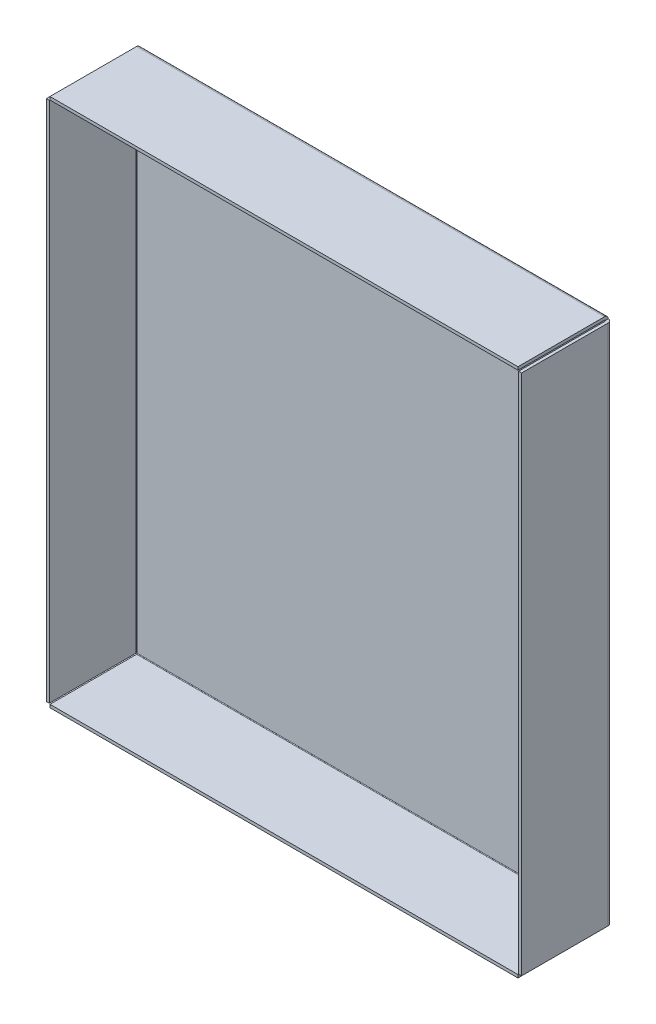
ISO-10303-21;
HEADER;
FILE_DESCRIPTION(('STEP AP214'),'2;1');
FILE_NAME('part.step','',(''),(''),'','','');
FILE_SCHEMA(('AUTOMOTIVE_DESIGN { 1 0 10303 214 1 1 1 1 }'));
ENDSEC;
DATA;
#1=APPLICATION_CONTEXT('core data for automotive mechanical design processes');
#2=APPLICATION_PROTOCOL_DEFINITION('international standard','automotive_design',2000,#1);
#3=PRODUCT_CONTEXT('',#1,'mechanical');
#4=PRODUCT('Part','Part','',(#3));
#5=PRODUCT_RELATED_PRODUCT_CATEGORY('part','',(#4));
#6=PRODUCT_DEFINITION_FORMATION('','',#4);
#7=PRODUCT_DEFINITION_CONTEXT('part definition',#1,'design');
#8=PRODUCT_DEFINITION('design','',#6,#7);
#9=PRODUCT_DEFINITION_SHAPE('','',#8);
#10=(LENGTH_UNIT() NAMED_UNIT(*) SI_UNIT(.MILLI.,.METRE.));
#11=(NAMED_UNIT(*) PLANE_ANGLE_UNIT() SI_UNIT($,.RADIAN.));
#12=(NAMED_UNIT(*) SI_UNIT($,.STERADIAN.) SOLID_ANGLE_UNIT());
#13=UNCERTAINTY_MEASURE_WITH_UNIT(LENGTH_MEASURE(1.E-05),#10,'distance_accuracy_value','');
#14=(GEOMETRIC_REPRESENTATION_CONTEXT(3) GLOBAL_UNCERTAINTY_ASSIGNED_CONTEXT((#13)) GLOBAL_UNIT_ASSIGNED_CONTEXT((#10,
#11,#12)) REPRESENTATION_CONTEXT('',''));
#15=CARTESIAN_POINT('',(0.,0.,0.));
#16=DIRECTION('',(0.,0.,1.));
#17=DIRECTION('',(1.,0.,0.));
#18=AXIS2_PLACEMENT_3D('',#15,#16,#17);
#19=CARTESIAN_POINT('',(-7.78,8.748717446278,1.505873217489));
#20=DIRECTION('',(-1.,0.,0.));
#21=DIRECTION('',(0.,1.,0.));
#22=AXIS2_PLACEMENT_3D('',#19,#20,#21);
#23=PLANE('',#22);
#24=CARTESIAN_POINT('',(-7.78,8.68,0.12));
#25=DIRECTION('',(1.,0.,0.));
#26=DIRECTION('',(0.,0.,-1.));
#27=AXIS2_PLACEMENT_3D('',#24,#25,#26);
#28=CIRCLE('',#27,0.12);
#29=CARTESIAN_POINT('',(-7.78,8.68,0.));
#30=VERTEX_POINT('',#29);
#31=CARTESIAN_POINT('',(-7.78,8.8,0.12));
#32=VERTEX_POINT('',#31);
#33=EDGE_CURVE('E381',#30,#32,#28,.T.);
#34=ORIENTED_EDGE('',*,*,#33,.F.);
#35=DIRECTION('',(0.,0.,1.));
#36=VECTOR('',#35,1.);
#37=CARTESIAN_POINT('',(-7.78,8.68,0.));
#38=LINE('',#37,#36);
#39=CARTESIAN_POINT('',(-7.78,8.68,0.1));
#40=VERTEX_POINT('',#39);
#41=EDGE_CURVE('E288',#30,#40,#38,.T.);
#42=ORIENTED_EDGE('',*,*,#41,.T.);
#43=CARTESIAN_POINT('',(-7.78,8.68,0.12));
#44=DIRECTION('',(1.,0.,0.));
#45=DIRECTION('',(0.,0.,-1.));
#46=AXIS2_PLACEMENT_3D('',#43,#44,#45);
#47=CIRCLE('',#46,0.02);
#48=CARTESIAN_POINT('',(-7.78,8.7,0.12));
#49=VERTEX_POINT('',#48);
#50=EDGE_CURVE('E308',#40,#49,#47,.T.);
#51=ORIENTED_EDGE('',*,*,#50,.T.);
#52=DIRECTION('',(0.,0.,1.));
#53=VECTOR('',#52,1.);
#54=CARTESIAN_POINT('',(-7.78,8.7,0.12));
#55=LINE('',#54,#53);
#56=CARTESIAN_POINT('',(-7.78,8.7,3.));
#57=VERTEX_POINT('',#56);
#58=EDGE_CURVE('E275',#49,#57,#55,.T.);
#59=ORIENTED_EDGE('',*,*,#58,.T.);
#60=DIRECTION('',(0.,-1.,0.));
#61=VECTOR('',#60,1.);
#62=CARTESIAN_POINT('',(-7.78,8.8,3.));
#63=LINE('',#62,#61);
#64=CARTESIAN_POINT('',(-7.78,8.8,3.));
#65=VERTEX_POINT('',#64);
#66=EDGE_CURVE('E347',#65,#57,#63,.T.);
#67=ORIENTED_EDGE('',*,*,#66,.F.);
#68=DIRECTION('',(0.,0.,1.));
#69=VECTOR('',#68,1.);
#70=CARTESIAN_POINT('',(-7.78,8.8,0.12));
#71=LINE('',#70,#69);
#72=EDGE_CURVE('E325',#32,#65,#71,.T.);
#73=ORIENTED_EDGE('',*,*,#72,.F.);
#74=EDGE_LOOP('',(#34,#42,#51,#59,#67,#73));
#75=FACE_BOUND('',#74,.T.);
#76=ADVANCED_FACE('F17',(#75),#23,.T.);
#77=CARTESIAN_POINT('',(-7.78,-8.748717446278,1.505873217489));
#78=DIRECTION('',(-1.,0.,0.));
#79=DIRECTION('',(0.,0.,1.));
#80=AXIS2_PLACEMENT_3D('',#77,#78,#79);
#81=PLANE('',#80);
#82=CARTESIAN_POINT('',(-7.78,-8.68,0.12));
#83=DIRECTION('',(-1.,0.,0.));
#84=DIRECTION('',(0.,0.,-1.));
#85=AXIS2_PLACEMENT_3D('',#82,#83,#84);
#86=CIRCLE('',#85,0.12);
#87=CARTESIAN_POINT('',(-7.78,-8.68,0.));
#88=VERTEX_POINT('',#87);
#89=CARTESIAN_POINT('',(-7.78,-8.8,0.12));
#90=VERTEX_POINT('',#89);
#91=EDGE_CURVE('E377',#88,#90,#86,.T.);
#92=ORIENTED_EDGE('',*,*,#91,.T.);
#93=DIRECTION('',(0.,0.,1.));
#94=VECTOR('',#93,1.);
#95=CARTESIAN_POINT('',(-7.78,-8.8,0.12));
#96=LINE('',#95,#94);
#97=CARTESIAN_POINT('',(-7.78,-8.8,3.));
#98=VERTEX_POINT('',#97);
#99=EDGE_CURVE('E330',#90,#98,#96,.T.);
#100=ORIENTED_EDGE('',*,*,#99,.T.);
#101=DIRECTION('',(0.,1.,0.));
#102=VECTOR('',#101,1.);
#103=CARTESIAN_POINT('',(-7.78,-8.8,3.));
#104=LINE('',#103,#102);
#105=CARTESIAN_POINT('',(-7.78,-8.7,3.));
#106=VERTEX_POINT('',#105);
#107=EDGE_CURVE('E348',#98,#106,#104,.T.);
#108=ORIENTED_EDGE('',*,*,#107,.T.);
#109=DIRECTION('',(0.,0.,1.));
#110=VECTOR('',#109,1.);
#111=CARTESIAN_POINT('',(-7.78,-8.7,0.12));
#112=LINE('',#111,#110);
#113=CARTESIAN_POINT('',(-7.78,-8.7,0.12));
#114=VERTEX_POINT('',#113);
#115=EDGE_CURVE('E284',#114,#106,#112,.T.);
#116=ORIENTED_EDGE('',*,*,#115,.F.);
#117=CARTESIAN_POINT('',(-7.78,-8.68,0.12));
#118=DIRECTION('',(-1.,0.,0.));
#119=DIRECTION('',(0.,0.,-1.));
#120=AXIS2_PLACEMENT_3D('',#117,#118,#119);
#121=CIRCLE('',#120,0.02);
#122=CARTESIAN_POINT('',(-7.78,-8.68,0.1));
#123=VERTEX_POINT('',#122);
#124=EDGE_CURVE('E240',#123,#114,#121,.T.);
#125=ORIENTED_EDGE('',*,*,#124,.F.);
#126=DIRECTION('',(0.,0.,1.));
#127=VECTOR('',#126,1.);
#128=CARTESIAN_POINT('',(-7.78,-8.68,0.));
#129=LINE('',#128,#127);
#130=EDGE_CURVE('E28',#88,#123,#129,.T.);
#131=ORIENTED_EDGE('',*,*,#130,.F.);
#132=EDGE_LOOP('',(#92,#100,#108,#116,#125,#131));
#133=FACE_BOUND('',#132,.T.);
#134=ADVANCED_FACE('F534',(#133),#81,.T.);
#135=CARTESIAN_POINT('',(7.78,8.748717446278,1.505873217489));
#136=DIRECTION('',(1.,0.,0.));
#137=DIRECTION('',(0.,1.,0.));
#138=AXIS2_PLACEMENT_3D('',#135,#136,#137);
#139=PLANE('',#138);
#140=CARTESIAN_POINT('',(7.78,8.68,0.12));
#141=DIRECTION('',(1.,0.,0.));
#142=DIRECTION('',(0.,0.,-1.));
#143=AXIS2_PLACEMENT_3D('',#140,#141,#142);
#144=CIRCLE('',#143,0.02);
#145=CARTESIAN_POINT('',(7.78,8.68,0.1));
#146=VERTEX_POINT('',#145);
#147=CARTESIAN_POINT('',(7.78,8.7,0.12));
#148=VERTEX_POINT('',#147);
#149=EDGE_CURVE('E309',#146,#148,#144,.T.);
#150=ORIENTED_EDGE('',*,*,#149,.F.);
#151=DIRECTION('',(0.,0.,1.));
#152=VECTOR('',#151,1.);
#153=CARTESIAN_POINT('',(7.78,8.68,0.));
#154=LINE('',#153,#152);
#155=CARTESIAN_POINT('',(7.78,8.68,0.));
#156=VERTEX_POINT('',#155);
#157=EDGE_CURVE('E285',#156,#146,#154,.T.);
#158=ORIENTED_EDGE('',*,*,#157,.F.);
#159=CARTESIAN_POINT('',(7.78,8.68,0.12));
#160=DIRECTION('',(1.,0.,0.));
#161=DIRECTION('',(0.,0.,-1.));
#162=AXIS2_PLACEMENT_3D('',#159,#160,#161);
#163=CIRCLE('',#162,0.12);
#164=CARTESIAN_POINT('',(7.78,8.8,0.12));
#165=VERTEX_POINT('',#164);
#166=EDGE_CURVE('E294',#156,#165,#163,.T.);
#167=ORIENTED_EDGE('',*,*,#166,.T.);
#168=DIRECTION('',(0.,0.,-1.));
#169=VECTOR('',#168,1.);
#170=CARTESIAN_POINT('',(7.78,8.8,3.));
#171=LINE('',#170,#169);
#172=CARTESIAN_POINT('',(7.78,8.8,3.));
#173=VERTEX_POINT('',#172);
#174=EDGE_CURVE('E462',#173,#165,#171,.T.);
#175=ORIENTED_EDGE('',*,*,#174,.F.);
#176=DIRECTION('',(0.,-1.,0.));
#177=VECTOR('',#176,1.);
#178=CARTESIAN_POINT('',(7.78,8.8,3.));
#179=LINE('',#178,#177);
#180=CARTESIAN_POINT('',(7.78,8.7,3.));
#181=VERTEX_POINT('',#180);
#182=EDGE_CURVE('E320',#173,#181,#179,.T.);
#183=ORIENTED_EDGE('',*,*,#182,.T.);
#184=DIRECTION('',(0.,0.,-1.));
#185=VECTOR('',#184,1.);
#186=CARTESIAN_POINT('',(7.78,8.7,3.));
#187=LINE('',#186,#185);
#188=EDGE_CURVE('E376',#181,#148,#187,.T.);
#189=ORIENTED_EDGE('',*,*,#188,.T.);
#190=EDGE_LOOP('',(#150,#158,#167,#175,#183,#189));
#191=FACE_BOUND('',#190,.T.);
#192=ADVANCED_FACE('F486',(#191),#139,.T.);
#193=CARTESIAN_POINT('',(7.78,-8.748717446278,1.505873217489));
#194=DIRECTION('',(1.,0.,0.));
#195=DIRECTION('',(0.,-1.,0.));
#196=AXIS2_PLACEMENT_3D('',#193,#194,#195);
#197=PLANE('',#196);
#198=CARTESIAN_POINT('',(7.78,-8.68,0.12));
#199=DIRECTION('',(-1.,0.,0.));
#200=DIRECTION('',(0.,0.,-1.));
#201=AXIS2_PLACEMENT_3D('',#198,#199,#200);
#202=CIRCLE('',#201,0.02);
#203=CARTESIAN_POINT('',(7.78,-8.68,0.1));
#204=VERTEX_POINT('',#203);
#205=CARTESIAN_POINT('',(7.78,-8.7,0.12));
#206=VERTEX_POINT('',#205);
#207=EDGE_CURVE('E259',#204,#206,#202,.T.);
#208=ORIENTED_EDGE('',*,*,#207,.T.);
#209=DIRECTION('',(0.,0.,-1.));
#210=VECTOR('',#209,1.);
#211=CARTESIAN_POINT('',(7.78,-8.7,3.));
#212=LINE('',#211,#210);
#213=CARTESIAN_POINT('',(7.78,-8.7,3.));
#214=VERTEX_POINT('',#213);
#215=EDGE_CURVE('E188',#214,#206,#212,.T.);
#216=ORIENTED_EDGE('',*,*,#215,.F.);
#217=DIRECTION('',(0.,1.,0.));
#218=VECTOR('',#217,1.);
#219=CARTESIAN_POINT('',(7.78,-8.8,3.));
#220=LINE('',#219,#218);
#221=CARTESIAN_POINT('',(7.78,-8.8,3.));
#222=VERTEX_POINT('',#221);
#223=EDGE_CURVE('E255',#222,#214,#220,.T.);
#224=ORIENTED_EDGE('',*,*,#223,.F.);
#225=DIRECTION('',(0.,0.,-1.));
#226=VECTOR('',#225,1.);
#227=CARTESIAN_POINT('',(7.78,-8.8,3.));
#228=LINE('',#227,#226);
#229=CARTESIAN_POINT('',(7.78,-8.8,0.12));
#230=VERTEX_POINT('',#229);
#231=EDGE_CURVE('E302',#222,#230,#228,.T.);
#232=ORIENTED_EDGE('',*,*,#231,.T.);
#233=CARTESIAN_POINT('',(7.78,-8.68,0.12));
#234=DIRECTION('',(-1.,0.,0.));
#235=DIRECTION('',(0.,0.,-1.));
#236=AXIS2_PLACEMENT_3D('',#233,#234,#235);
#237=CIRCLE('',#236,0.12);
#238=CARTESIAN_POINT('',(7.78,-8.68,0.));
#239=VERTEX_POINT('',#238);
#240=EDGE_CURVE('E418',#239,#230,#237,.T.);
#241=ORIENTED_EDGE('',*,*,#240,.F.);
#242=DIRECTION('',(0.,0.,1.));
#243=VECTOR('',#242,1.);
#244=CARTESIAN_POINT('',(7.78,-8.68,0.));
#245=LINE('',#244,#243);
#246=EDGE_CURVE('E11',#239,#204,#245,.T.);
#247=ORIENTED_EDGE('',*,*,#246,.T.);
#248=EDGE_LOOP('',(#208,#216,#224,#232,#241,#247));
#249=FACE_BOUND('',#248,.T.);
#250=ADVANCED_FACE('F561',(#249),#197,.T.);
#251=CARTESIAN_POINT('',(7.848717446278,-8.68,1.505873217489));
#252=DIRECTION('',(0.,-1.,0.));
#253=DIRECTION('',(0.,0.,-1.));
#254=AXIS2_PLACEMENT_3D('',#251,#252,#253);
#255=PLANE('',#254);
#256=CARTESIAN_POINT('',(7.78,-8.68,0.12));
#257=DIRECTION('',(0.,-1.,0.));
#258=DIRECTION('',(0.,0.,-1.));
#259=AXIS2_PLACEMENT_3D('',#256,#257,#258);
#260=CIRCLE('',#259,0.12);
#261=CARTESIAN_POINT('',(7.9,-8.68,0.12));
#262=VERTEX_POINT('',#261);
#263=EDGE_CURVE('E295',#239,#262,#260,.T.);
#264=ORIENTED_EDGE('',*,*,#263,.T.);
#265=DIRECTION('',(0.,0.,1.));
#266=VECTOR('',#265,1.);
#267=CARTESIAN_POINT('',(7.9,-8.68,0.12));
#268=LINE('',#267,#266);
#269=CARTESIAN_POINT('',(7.9,-8.68,3.));
#270=VERTEX_POINT('',#269);
#271=EDGE_CURVE('E341',#262,#270,#268,.T.);
#272=ORIENTED_EDGE('',*,*,#271,.T.);
#273=DIRECTION('',(-1.,0.,0.));
#274=VECTOR('',#273,1.);
#275=CARTESIAN_POINT('',(7.9,-8.68,3.));
#276=LINE('',#275,#274);
#277=CARTESIAN_POINT('',(7.8,-8.68,3.));
#278=VERTEX_POINT('',#277);
#279=EDGE_CURVE('E229',#270,#278,#276,.T.);
#280=ORIENTED_EDGE('',*,*,#279,.T.);
#281=DIRECTION('',(0.,0.,1.));
#282=VECTOR('',#281,1.);
#283=CARTESIAN_POINT('',(7.8,-8.68,0.12));
#284=LINE('',#283,#282);
#285=CARTESIAN_POINT('',(7.8,-8.68,0.12));
#286=VERTEX_POINT('',#285);
#287=EDGE_CURVE('E42',#286,#278,#284,.T.);
#288=ORIENTED_EDGE('',*,*,#287,.F.);
#289=CARTESIAN_POINT('',(7.78,-8.68,0.12));
#290=DIRECTION('',(0.,-1.,0.));
#291=DIRECTION('',(0.,0.,-1.));
#292=AXIS2_PLACEMENT_3D('',#289,#290,#291);
#293=CIRCLE('',#292,0.02);
#294=EDGE_CURVE('E313',#204,#286,#293,.T.);
#295=ORIENTED_EDGE('',*,*,#294,.F.);
#296=ORIENTED_EDGE('',*,*,#246,.F.);
#297=EDGE_LOOP('',(#264,#272,#280,#288,#295,#296));
#298=FACE_BOUND('',#297,.T.);
#299=ADVANCED_FACE('F557',(#298),#255,.T.);
#300=CARTESIAN_POINT('',(-7.848717446278,-8.68,1.505873217489));
#301=DIRECTION('',(0.,-1.,0.));
#302=DIRECTION('',(0.,0.,-1.));
#303=AXIS2_PLACEMENT_3D('',#300,#301,#302);
#304=PLANE('',#303);
#305=CARTESIAN_POINT('',(-7.78,-8.68,0.12));
#306=DIRECTION('',(0.,1.,0.));
#307=DIRECTION('',(0.,0.,-1.));
#308=AXIS2_PLACEMENT_3D('',#305,#306,#307);
#309=CIRCLE('',#308,0.12);
#310=CARTESIAN_POINT('',(-7.9,-8.68,0.12));
#311=VERTEX_POINT('',#310);
#312=EDGE_CURVE('E360',#88,#311,#309,.T.);
#313=ORIENTED_EDGE('',*,*,#312,.F.);
#314=ORIENTED_EDGE('',*,*,#130,.T.);
#315=CARTESIAN_POINT('',(-7.78,-8.68,0.12));
#316=DIRECTION('',(0.,1.,0.));
#317=DIRECTION('',(0.,0.,-1.));
#318=AXIS2_PLACEMENT_3D('',#315,#316,#317);
#319=CIRCLE('',#318,0.02);
#320=CARTESIAN_POINT('',(-7.8,-8.68,0.12));
#321=VERTEX_POINT('',#320);
#322=EDGE_CURVE('E21',#123,#321,#319,.T.);
#323=ORIENTED_EDGE('',*,*,#322,.T.);
#324=DIRECTION('',(0.,0.,1.));
#325=VECTOR('',#324,1.);
#326=CARTESIAN_POINT('',(-7.8,-8.68,0.12));
#327=LINE('',#326,#325);
#328=CARTESIAN_POINT('',(-7.8,-8.68,3.));
#329=VERTEX_POINT('',#328);
#330=EDGE_CURVE('E210',#321,#329,#327,.T.);
#331=ORIENTED_EDGE('',*,*,#330,.T.);
#332=DIRECTION('',(1.,0.,0.));
#333=VECTOR('',#332,1.);
#334=CARTESIAN_POINT('',(-7.9,-8.68,3.));
#335=LINE('',#334,#333);
#336=CARTESIAN_POINT('',(-7.9,-8.68,3.));
#337=VERTEX_POINT('',#336);
#338=EDGE_CURVE('E243',#337,#329,#335,.T.);
#339=ORIENTED_EDGE('',*,*,#338,.F.);
#340=DIRECTION('',(0.,0.,1.));
#341=VECTOR('',#340,1.);
#342=CARTESIAN_POINT('',(-7.9,-8.68,0.12));
#343=LINE('',#342,#341);
#344=EDGE_CURVE('E316',#311,#337,#343,.T.);
#345=ORIENTED_EDGE('',*,*,#344,.F.);
#346=EDGE_LOOP('',(#313,#314,#323,#331,#339,#345));
#347=FACE_BOUND('',#346,.T.);
#348=ADVANCED_FACE('F560',(#347),#304,.T.);
#349=CARTESIAN_POINT('',(7.848717446278,8.68,1.505873217489));
#350=DIRECTION('',(0.,1.,0.));
#351=DIRECTION('',(1.,0.,0.));
#352=AXIS2_PLACEMENT_3D('',#349,#350,#351);
#353=PLANE('',#352);
#354=CARTESIAN_POINT('',(7.78,8.68,0.12));
#355=DIRECTION('',(0.,-1.,0.));
#356=DIRECTION('',(0.,0.,-1.));
#357=AXIS2_PLACEMENT_3D('',#354,#355,#356);
#358=CIRCLE('',#357,0.02);
#359=CARTESIAN_POINT('',(7.8,8.68,0.12));
#360=VERTEX_POINT('',#359);
#361=EDGE_CURVE('E266',#146,#360,#358,.T.);
#362=ORIENTED_EDGE('',*,*,#361,.T.);
#363=DIRECTION('',(0.,0.,-1.));
#364=VECTOR('',#363,1.);
#365=CARTESIAN_POINT('',(7.8,8.68,3.));
#366=LINE('',#365,#364);
#367=CARTESIAN_POINT('',(7.8,8.68,3.));
#368=VERTEX_POINT('',#367);
#369=EDGE_CURVE('E274',#368,#360,#366,.T.);
#370=ORIENTED_EDGE('',*,*,#369,.F.);
#371=DIRECTION('',(-1.,0.,0.));
#372=VECTOR('',#371,1.);
#373=CARTESIAN_POINT('',(7.9,8.68,3.));
#374=LINE('',#373,#372);
#375=CARTESIAN_POINT('',(7.9,8.68,3.));
#376=VERTEX_POINT('',#375);
#377=EDGE_CURVE('E270',#376,#368,#374,.T.);
#378=ORIENTED_EDGE('',*,*,#377,.F.);
#379=DIRECTION('',(0.,0.,-1.));
#380=VECTOR('',#379,1.);
#381=CARTESIAN_POINT('',(7.9,8.68,3.));
#382=LINE('',#381,#380);
#383=CARTESIAN_POINT('',(7.9,8.68,0.12));
#384=VERTEX_POINT('',#383);
#385=EDGE_CURVE('E342',#376,#384,#382,.T.);
#386=ORIENTED_EDGE('',*,*,#385,.T.);
#387=CARTESIAN_POINT('',(7.78,8.68,0.12));
#388=DIRECTION('',(0.,-1.,0.));
#389=DIRECTION('',(0.,0.,-1.));
#390=AXIS2_PLACEMENT_3D('',#387,#388,#389);
#391=CIRCLE('',#390,0.12);
#392=EDGE_CURVE('E289',#156,#384,#391,.T.);
#393=ORIENTED_EDGE('',*,*,#392,.F.);
#394=ORIENTED_EDGE('',*,*,#157,.T.);
#395=EDGE_LOOP('',(#362,#370,#378,#386,#393,#394));
#396=FACE_BOUND('',#395,.T.);
#397=ADVANCED_FACE('F505',(#396),#353,.T.);
#398=CARTESIAN_POINT('',(-7.848717446278,8.68,1.505873217489));
#399=DIRECTION('',(0.,1.,0.));
#400=DIRECTION('',(1.,0.,0.));
#401=AXIS2_PLACEMENT_3D('',#398,#399,#400);
#402=PLANE('',#401);
#403=CARTESIAN_POINT('',(-7.78,8.68,0.12));
#404=DIRECTION('',(0.,1.,0.));
#405=DIRECTION('',(0.,0.,-1.));
#406=AXIS2_PLACEMENT_3D('',#403,#404,#405);
#407=CIRCLE('',#406,0.02);
#408=CARTESIAN_POINT('',(-7.8,8.68,0.12));
#409=VERTEX_POINT('',#408);
#410=EDGE_CURVE('E361',#40,#409,#407,.T.);
#411=ORIENTED_EDGE('',*,*,#410,.F.);
#412=ORIENTED_EDGE('',*,*,#41,.F.);
#413=CARTESIAN_POINT('',(-7.78,8.68,0.12));
#414=DIRECTION('',(0.,1.,0.));
#415=DIRECTION('',(0.,0.,-1.));
#416=AXIS2_PLACEMENT_3D('',#413,#414,#415);
#417=CIRCLE('',#416,0.12);
#418=CARTESIAN_POINT('',(-7.9,8.68,0.12));
#419=VERTEX_POINT('',#418);
#420=EDGE_CURVE('E359',#30,#419,#417,.T.);
#421=ORIENTED_EDGE('',*,*,#420,.T.);
#422=DIRECTION('',(0.,0.,-1.));
#423=VECTOR('',#422,1.);
#424=CARTESIAN_POINT('',(-7.9,8.68,3.));
#425=LINE('',#424,#423);
#426=CARTESIAN_POINT('',(-7.9,8.68,3.));
#427=VERTEX_POINT('',#426);
#428=EDGE_CURVE('E235',#427,#419,#425,.T.);
#429=ORIENTED_EDGE('',*,*,#428,.F.);
#430=DIRECTION('',(1.,0.,0.));
#431=VECTOR('',#430,1.);
#432=CARTESIAN_POINT('',(-7.9,8.68,3.));
#433=LINE('',#432,#431);
#434=CARTESIAN_POINT('',(-7.8,8.68,3.));
#435=VERTEX_POINT('',#434);
#436=EDGE_CURVE('E232',#427,#435,#433,.T.);
#437=ORIENTED_EDGE('',*,*,#436,.T.);
#438=DIRECTION('',(0.,0.,-1.));
#439=VECTOR('',#438,1.);
#440=CARTESIAN_POINT('',(-7.8,8.68,3.));
#441=LINE('',#440,#439);
#442=EDGE_CURVE('E217',#435,#409,#441,.T.);
#443=ORIENTED_EDGE('',*,*,#442,.T.);
#444=EDGE_LOOP('',(#411,#412,#421,#429,#437,#443));
#445=FACE_BOUND('',#444,.T.);
#446=ADVANCED_FACE('F233',(#445),#402,.T.);
#447=CARTESIAN_POINT('',(7.8,0.,1.56));
#448=DIRECTION('',(-1.,0.,0.));
#449=DIRECTION('',(0.,0.,1.));
#450=AXIS2_PLACEMENT_3D('',#447,#448,#449);
#451=PLANE('',#450);
#452=DIRECTION('',(0.,1.,0.));
#453=VECTOR('',#452,1.);
#454=CARTESIAN_POINT('',(7.8,-8.68,0.12));
#455=LINE('',#454,#453);
#456=EDGE_CURVE('E271',#286,#360,#455,.T.);
#457=ORIENTED_EDGE('',*,*,#456,.F.);
#458=ORIENTED_EDGE('',*,*,#287,.T.);
#459=DIRECTION('',(0.,1.,0.));
#460=VECTOR('',#459,1.);
#461=CARTESIAN_POINT('',(7.8,-8.68,3.));
#462=LINE('',#461,#460);
#463=EDGE_CURVE('E352',#278,#368,#462,.T.);
#464=ORIENTED_EDGE('',*,*,#463,.T.);
#465=ORIENTED_EDGE('',*,*,#369,.T.);
#466=EDGE_LOOP('',(#457,#458,#464,#465));
#467=FACE_BOUND('',#466,.T.);
#468=ADVANCED_FACE('F552',(#467),#451,.T.);
#469=CARTESIAN_POINT('',(0.,8.7,1.56));
#470=DIRECTION('',(0.,1.,0.));
#471=DIRECTION('',(1.,0.,0.));
#472=AXIS2_PLACEMENT_3D('',#469,#470,#471);
#473=PLANE('',#472);
#474=ORIENTED_EDGE('',*,*,#188,.F.);
#475=DIRECTION('',(1.,0.,0.));
#476=VECTOR('',#475,1.);
#477=CARTESIAN_POINT('',(-7.78,8.7,3.));
#478=LINE('',#477,#476);
#479=EDGE_CURVE('E343',#57,#181,#478,.T.);
#480=ORIENTED_EDGE('',*,*,#479,.F.);
#481=ORIENTED_EDGE('',*,*,#58,.F.);
#482=DIRECTION('',(1.,0.,0.));
#483=VECTOR('',#482,1.);
#484=CARTESIAN_POINT('',(-7.78,8.7,0.12));
#485=LINE('',#484,#483);
#486=EDGE_CURVE('E304',#49,#148,#485,.T.);
#487=ORIENTED_EDGE('',*,*,#486,.T.);
#488=EDGE_LOOP('',(#474,#480,#481,#487));
#489=FACE_BOUND('',#488,.T.);
#490=ADVANCED_FACE('F491',(#489),#473,.F.);
#491=CARTESIAN_POINT('',(0.,-8.7,1.56));
#492=DIRECTION('',(0.,1.,0.));
#493=DIRECTION('',(1.,0.,0.));
#494=AXIS2_PLACEMENT_3D('',#491,#492,#493);
#495=PLANE('',#494);
#496=DIRECTION('',(1.,0.,0.));
#497=VECTOR('',#496,1.);
#498=CARTESIAN_POINT('',(-7.78,-8.7,0.12));
#499=LINE('',#498,#497);
#500=EDGE_CURVE('E401',#114,#206,#499,.T.);
#501=ORIENTED_EDGE('',*,*,#500,.F.);
#502=ORIENTED_EDGE('',*,*,#115,.T.);
#503=DIRECTION('',(1.,0.,0.));
#504=VECTOR('',#503,1.);
#505=CARTESIAN_POINT('',(-7.78,-8.7,3.));
#506=LINE('',#505,#504);
#507=EDGE_CURVE('E258',#106,#214,#506,.T.);
#508=ORIENTED_EDGE('',*,*,#507,.T.);
#509=ORIENTED_EDGE('',*,*,#215,.T.);
#510=EDGE_LOOP('',(#501,#502,#508,#509));
#511=FACE_BOUND('',#510,.T.);
#512=ADVANCED_FACE('F547',(#511),#495,.T.);
#513=CARTESIAN_POINT('',(-7.8,0.,1.56));
#514=DIRECTION('',(-1.,0.,0.));
#515=DIRECTION('',(0.,0.,1.));
#516=AXIS2_PLACEMENT_3D('',#513,#514,#515);
#517=PLANE('',#516);
#518=ORIENTED_EDGE('',*,*,#442,.F.);
#519=DIRECTION('',(0.,1.,0.));
#520=VECTOR('',#519,1.);
#521=CARTESIAN_POINT('',(-7.8,-8.68,3.));
#522=LINE('',#521,#520);
#523=EDGE_CURVE('E221',#329,#435,#522,.T.);
#524=ORIENTED_EDGE('',*,*,#523,.F.);
#525=ORIENTED_EDGE('',*,*,#330,.F.);
#526=DIRECTION('',(0.,1.,0.));
#527=VECTOR('',#526,1.);
#528=CARTESIAN_POINT('',(-7.8,-8.68,0.12));
#529=LINE('',#528,#527);
#530=EDGE_CURVE('E224',#321,#409,#529,.T.);
#531=ORIENTED_EDGE('',*,*,#530,.T.);
#532=EDGE_LOOP('',(#518,#524,#525,#531));
#533=FACE_BOUND('',#532,.T.);
#534=ADVANCED_FACE('F219',(#533),#517,.F.);
#535=CARTESIAN_POINT('',(7.9,-8.68,3.));
#536=DIRECTION('',(0.,0.,-1.));
#537=DIRECTION('',(0.,-1.,0.));
#538=AXIS2_PLACEMENT_3D('',#535,#536,#537);
#539=PLANE('',#538);
#540=DIRECTION('',(0.,1.,0.));
#541=VECTOR('',#540,1.);
#542=CARTESIAN_POINT('',(7.9,-8.68,3.));
#543=LINE('',#542,#541);
#544=EDGE_CURVE('E337',#270,#376,#543,.T.);
#545=ORIENTED_EDGE('',*,*,#544,.T.);
#546=ORIENTED_EDGE('',*,*,#377,.T.);
#547=ORIENTED_EDGE('',*,*,#463,.F.);
#548=ORIENTED_EDGE('',*,*,#279,.F.);
#549=EDGE_LOOP('',(#545,#546,#547,#548));
#550=FACE_BOUND('',#549,.T.);
#551=ADVANCED_FACE('F529',(#550),#539,.F.);
#552=CARTESIAN_POINT('',(7.78,-8.68,0.12));
#553=DIRECTION('',(0.,1.,0.));
#554=DIRECTION('',(0.,0.,-1.));
#555=AXIS2_PLACEMENT_3D('',#552,#553,#554);
#556=CYLINDRICAL_SURFACE('',#555,0.02);
#557=ORIENTED_EDGE('',*,*,#294,.T.);
#558=ORIENTED_EDGE('',*,*,#456,.T.);
#559=ORIENTED_EDGE('',*,*,#361,.F.);
#560=DIRECTION('',(0.,1.,0.));
#561=VECTOR('',#560,1.);
#562=CARTESIAN_POINT('',(7.78,-8.68,0.1));
#563=LINE('',#562,#561);
#564=EDGE_CURVE('E264',#204,#146,#563,.T.);
#565=ORIENTED_EDGE('',*,*,#564,.F.);
#566=EDGE_LOOP('',(#557,#558,#559,#565));
#567=FACE_BOUND('',#566,.T.);
#568=ADVANCED_FACE('F502',(#567),#556,.F.);
#569=CARTESIAN_POINT('',(-7.78,8.8,3.));
#570=DIRECTION('',(0.,0.,1.));
#571=DIRECTION('',(1.,0.,0.));
#572=AXIS2_PLACEMENT_3D('',#569,#570,#571);
#573=PLANE('',#572);
#574=ORIENTED_EDGE('',*,*,#66,.T.);
#575=ORIENTED_EDGE('',*,*,#479,.T.);
#576=ORIENTED_EDGE('',*,*,#182,.F.);
#577=DIRECTION('',(1.,0.,0.));
#578=VECTOR('',#577,1.);
#579=CARTESIAN_POINT('',(-7.78,8.8,3.));
#580=LINE('',#579,#578);
#581=EDGE_CURVE('E329',#65,#173,#580,.T.);
#582=ORIENTED_EDGE('',*,*,#581,.F.);
#583=EDGE_LOOP('',(#574,#575,#576,#582));
#584=FACE_BOUND('',#583,.T.);
#585=ADVANCED_FACE('F517',(#584),#573,.T.);
#586=CARTESIAN_POINT('',(-7.78,8.68,0.12));
#587=DIRECTION('',(1.,0.,0.));
#588=DIRECTION('',(0.,0.,-1.));
#589=AXIS2_PLACEMENT_3D('',#586,#587,#588);
#590=CYLINDRICAL_SURFACE('',#589,0.02);
#591=DIRECTION('',(1.,0.,0.));
#592=VECTOR('',#591,1.);
#593=CARTESIAN_POINT('',(-7.78,8.68,0.1));
#594=LINE('',#593,#592);
#595=EDGE_CURVE('E253',#40,#146,#594,.T.);
#596=ORIENTED_EDGE('',*,*,#595,.T.);
#597=ORIENTED_EDGE('',*,*,#149,.T.);
#598=ORIENTED_EDGE('',*,*,#486,.F.);
#599=ORIENTED_EDGE('',*,*,#50,.F.);
#600=EDGE_LOOP('',(#596,#597,#598,#599));
#601=FACE_BOUND('',#600,.T.);
#602=ADVANCED_FACE('F19',(#601),#590,.F.);
#603=CARTESIAN_POINT('',(-7.78,-8.8,3.));
#604=DIRECTION('',(0.,0.,-1.));
#605=DIRECTION('',(0.,-1.,0.));
#606=AXIS2_PLACEMENT_3D('',#603,#604,#605);
#607=PLANE('',#606);
#608=DIRECTION('',(1.,0.,0.));
#609=VECTOR('',#608,1.);
#610=CARTESIAN_POINT('',(-7.78,-8.8,3.));
#611=LINE('',#610,#609);
#612=EDGE_CURVE('E336',#98,#222,#611,.T.);
#613=ORIENTED_EDGE('',*,*,#612,.T.);
#614=ORIENTED_EDGE('',*,*,#223,.T.);
#615=ORIENTED_EDGE('',*,*,#507,.F.);
#616=ORIENTED_EDGE('',*,*,#107,.F.);
#617=EDGE_LOOP('',(#613,#614,#615,#616));
#618=FACE_BOUND('',#617,.T.);
#619=ADVANCED_FACE('F528',(#618),#607,.F.);
#620=CARTESIAN_POINT('',(-7.78,-8.68,0.12));
#621=DIRECTION('',(1.,0.,0.));
#622=DIRECTION('',(0.,0.,-1.));
#623=AXIS2_PLACEMENT_3D('',#620,#621,#622);
#624=CYLINDRICAL_SURFACE('',#623,0.02);
#625=ORIENTED_EDGE('',*,*,#124,.T.);
#626=ORIENTED_EDGE('',*,*,#500,.T.);
#627=ORIENTED_EDGE('',*,*,#207,.F.);
#628=DIRECTION('',(1.,0.,0.));
#629=VECTOR('',#628,1.);
#630=CARTESIAN_POINT('',(-7.78,-8.68,0.1));
#631=LINE('',#630,#629);
#632=EDGE_CURVE('E260',#123,#204,#631,.T.);
#633=ORIENTED_EDGE('',*,*,#632,.F.);
#634=EDGE_LOOP('',(#625,#626,#627,#633));
#635=FACE_BOUND('',#634,.T.);
#636=ADVANCED_FACE('F565',(#635),#624,.F.);
#637=CARTESIAN_POINT('',(-7.9,-8.68,3.));
#638=DIRECTION('',(0.,0.,1.));
#639=DIRECTION('',(1.,0.,0.));
#640=AXIS2_PLACEMENT_3D('',#637,#638,#639);
#641=PLANE('',#640);
#642=ORIENTED_EDGE('',*,*,#338,.T.);
#643=ORIENTED_EDGE('',*,*,#523,.T.);
#644=ORIENTED_EDGE('',*,*,#436,.F.);
#645=DIRECTION('',(0.,1.,0.));
#646=VECTOR('',#645,1.);
#647=CARTESIAN_POINT('',(-7.9,-8.68,3.));
#648=LINE('',#647,#646);
#649=EDGE_CURVE('E303',#337,#427,#648,.T.);
#650=ORIENTED_EDGE('',*,*,#649,.F.);
#651=EDGE_LOOP('',(#642,#643,#644,#650));
#652=FACE_BOUND('',#651,.T.);
#653=ADVANCED_FACE('F242',(#652),#641,.T.);
#654=CARTESIAN_POINT('',(-7.78,-8.68,0.12));
#655=DIRECTION('',(0.,1.,0.));
#656=DIRECTION('',(0.,0.,-1.));
#657=AXIS2_PLACEMENT_3D('',#654,#655,#656);
#658=CYLINDRICAL_SURFACE('',#657,0.02);
#659=DIRECTION('',(0.,1.,0.));
#660=VECTOR('',#659,1.);
#661=CARTESIAN_POINT('',(-7.78,-8.68,0.1));
#662=LINE('',#661,#660);
#663=EDGE_CURVE('E265',#123,#40,#662,.T.);
#664=ORIENTED_EDGE('',*,*,#663,.T.);
#665=ORIENTED_EDGE('',*,*,#410,.T.);
#666=ORIENTED_EDGE('',*,*,#530,.F.);
#667=ORIENTED_EDGE('',*,*,#322,.F.);
#668=EDGE_LOOP('',(#664,#665,#666,#667));
#669=FACE_BOUND('',#668,.T.);
#670=ADVANCED_FACE('F543',(#669),#658,.F.);
#671=CARTESIAN_POINT('',(-7.78,-8.68,0.1));
#672=DIRECTION('',(0.,0.,1.));
#673=DIRECTION('',(1.,0.,0.));
#674=AXIS2_PLACEMENT_3D('',#671,#672,#673);
#675=PLANE('',#674);
#676=CARTESIAN_POINT('',(-5.774405,6.910631,0.1));
#677=DIRECTION('',(0.,0.,-1.));
#678=DIRECTION('',(1.,0.,0.));
#679=AXIS2_PLACEMENT_3D('',#676,#677,#678);
#680=CIRCLE('',#679,0.5);
#681=CARTESIAN_POINT('',(-5.274405,6.910631,0.1));
#682=VERTEX_POINT('',#681);
#683=EDGE_CURVE('E324',#682,#682,#680,.T.);
#684=ORIENTED_EDGE('',*,*,#683,.T.);
#685=EDGE_LOOP('',(#684));
#686=FACE_BOUND('',#685,.T.);
#687=ORIENTED_EDGE('',*,*,#663,.F.);
#688=ORIENTED_EDGE('',*,*,#632,.T.);
#689=ORIENTED_EDGE('',*,*,#564,.T.);
#690=ORIENTED_EDGE('',*,*,#595,.F.);
#691=EDGE_LOOP('',(#687,#688,#689,#690));
#692=FACE_BOUND('',#691,.T.);
#693=ADVANCED_FACE('F498',(#686,#692),#675,.T.);
#694=CARTESIAN_POINT('',(7.9,0.,1.56));
#695=DIRECTION('',(-1.,0.,0.));
#696=DIRECTION('',(0.,0.,1.));
#697=AXIS2_PLACEMENT_3D('',#694,#695,#696);
#698=PLANE('',#697);
#699=ORIENTED_EDGE('',*,*,#385,.F.);
#700=ORIENTED_EDGE('',*,*,#544,.F.);
#701=ORIENTED_EDGE('',*,*,#271,.F.);
#702=DIRECTION('',(0.,-1.,0.));
#703=VECTOR('',#702,1.);
#704=CARTESIAN_POINT('',(7.9,8.68,0.12));
#705=LINE('',#704,#703);
#706=EDGE_CURVE('E293',#384,#262,#705,.T.);
#707=ORIENTED_EDGE('',*,*,#706,.F.);
#708=EDGE_LOOP('',(#699,#700,#701,#707));
#709=FACE_BOUND('',#708,.T.);
#710=ADVANCED_FACE('F581',(#709),#698,.F.);
#711=CARTESIAN_POINT('',(0.,8.8,1.56));
#712=DIRECTION('',(0.,1.,0.));
#713=DIRECTION('',(1.,0.,0.));
#714=AXIS2_PLACEMENT_3D('',#711,#712,#713);
#715=PLANE('',#714);
#716=DIRECTION('',(-1.,0.,0.));
#717=VECTOR('',#716,1.);
#718=CARTESIAN_POINT('',(7.78,8.8,0.12));
#719=LINE('',#718,#717);
#720=EDGE_CURVE('E367',#165,#32,#719,.T.);
#721=ORIENTED_EDGE('',*,*,#720,.T.);
#722=ORIENTED_EDGE('',*,*,#72,.T.);
#723=ORIENTED_EDGE('',*,*,#581,.T.);
#724=ORIENTED_EDGE('',*,*,#174,.T.);
#725=EDGE_LOOP('',(#721,#722,#723,#724));
#726=FACE_BOUND('',#725,.T.);
#727=ADVANCED_FACE('F513',(#726),#715,.T.);
#728=CARTESIAN_POINT('',(0.,-8.8,1.56));
#729=DIRECTION('',(0.,1.,0.));
#730=DIRECTION('',(1.,0.,0.));
#731=AXIS2_PLACEMENT_3D('',#728,#729,#730);
#732=PLANE('',#731);
#733=ORIENTED_EDGE('',*,*,#231,.F.);
#734=ORIENTED_EDGE('',*,*,#612,.F.);
#735=ORIENTED_EDGE('',*,*,#99,.F.);
#736=DIRECTION('',(-1.,0.,0.));
#737=VECTOR('',#736,1.);
#738=CARTESIAN_POINT('',(7.78,-8.8,0.12));
#739=LINE('',#738,#737);
#740=EDGE_CURVE('E382',#230,#90,#739,.T.);
#741=ORIENTED_EDGE('',*,*,#740,.F.);
#742=EDGE_LOOP('',(#733,#734,#735,#741));
#743=FACE_BOUND('',#742,.T.);
#744=ADVANCED_FACE('F600',(#743),#732,.F.);
#745=CARTESIAN_POINT('',(-7.9,0.,1.56));
#746=DIRECTION('',(-1.,0.,0.));
#747=DIRECTION('',(0.,0.,1.));
#748=AXIS2_PLACEMENT_3D('',#745,#746,#747);
#749=PLANE('',#748);
#750=DIRECTION('',(0.,-1.,0.));
#751=VECTOR('',#750,1.);
#752=CARTESIAN_POINT('',(-7.9,8.68,0.12));
#753=LINE('',#752,#751);
#754=EDGE_CURVE('E355',#419,#311,#753,.T.);
#755=ORIENTED_EDGE('',*,*,#754,.T.);
#756=ORIENTED_EDGE('',*,*,#344,.T.);
#757=ORIENTED_EDGE('',*,*,#649,.T.);
#758=ORIENTED_EDGE('',*,*,#428,.T.);
#759=EDGE_LOOP('',(#755,#756,#757,#758));
#760=FACE_BOUND('',#759,.T.);
#761=ADVANCED_FACE('F620',(#760),#749,.T.);
#762=CARTESIAN_POINT('',(-5.774405,6.910631,0.));
#763=DIRECTION('',(0.,0.,-1.));
#764=DIRECTION('',(1.,0.,0.));
#765=AXIS2_PLACEMENT_3D('',#762,#763,#764);
#766=CYLINDRICAL_SURFACE('',#765,0.5);
#767=DIRECTION('',(0.,0.,1.));
#768=VECTOR('',#767,1.);
#769=CARTESIAN_POINT('',(-5.274405,6.910631,0.));
#770=LINE('',#769,#768);
#771=CARTESIAN_POINT('',(-5.274405,6.910631,0.));
#772=VERTEX_POINT('',#771);
#773=EDGE_CURVE('E299',#772,#682,#770,.T.);
#774=ORIENTED_EDGE('',*,*,#773,.T.);
#775=ORIENTED_EDGE('',*,*,#683,.F.);
#776=ORIENTED_EDGE('',*,*,#773,.F.);
#777=CARTESIAN_POINT('',(-5.774405,6.910631,0.));
#778=DIRECTION('',(0.,0.,-1.));
#779=DIRECTION('',(1.,0.,0.));
#780=AXIS2_PLACEMENT_3D('',#777,#778,#779);
#781=CIRCLE('',#780,0.5);
#782=EDGE_CURVE('E279',#772,#772,#781,.T.);
#783=ORIENTED_EDGE('',*,*,#782,.T.);
#784=EDGE_LOOP('',(#774,#775,#776,#783));
#785=FACE_BOUND('',#784,.T.);
#786=ADVANCED_FACE('F576',(#785),#766,.F.);
#787=CARTESIAN_POINT('',(7.78,8.68,0.12));
#788=DIRECTION('',(0.,-1.,0.));
#789=DIRECTION('',(0.,0.,-1.));
#790=AXIS2_PLACEMENT_3D('',#787,#788,#789);
#791=CYLINDRICAL_SURFACE('',#790,0.12);
#792=ORIENTED_EDGE('',*,*,#392,.T.);
#793=ORIENTED_EDGE('',*,*,#706,.T.);
#794=ORIENTED_EDGE('',*,*,#263,.F.);
#795=DIRECTION('',(0.,1.,0.));
#796=VECTOR('',#795,1.);
#797=CARTESIAN_POINT('',(7.78,-8.68,0.));
#798=LINE('',#797,#796);
#799=EDGE_CURVE('E409',#239,#156,#798,.T.);
#800=ORIENTED_EDGE('',*,*,#799,.T.);
#801=EDGE_LOOP('',(#792,#793,#794,#800));
#802=FACE_BOUND('',#801,.T.);
#803=ADVANCED_FACE('F551',(#802),#791,.T.);
#804=CARTESIAN_POINT('',(7.78,8.68,0.12));
#805=DIRECTION('',(-1.,0.,0.));
#806=DIRECTION('',(0.,0.,-1.));
#807=AXIS2_PLACEMENT_3D('',#804,#805,#806);
#808=CYLINDRICAL_SURFACE('',#807,0.12);
#809=DIRECTION('',(1.,0.,0.));
#810=VECTOR('',#809,1.);
#811=CARTESIAN_POINT('',(-7.78,8.68,0.));
#812=LINE('',#811,#810);
#813=EDGE_CURVE('E405',#30,#156,#812,.T.);
#814=ORIENTED_EDGE('',*,*,#813,.F.);
#815=ORIENTED_EDGE('',*,*,#33,.T.);
#816=ORIENTED_EDGE('',*,*,#720,.F.);
#817=ORIENTED_EDGE('',*,*,#166,.F.);
#818=EDGE_LOOP('',(#814,#815,#816,#817));
#819=FACE_BOUND('',#818,.T.);
#820=ADVANCED_FACE('F511',(#819),#808,.T.);
#821=CARTESIAN_POINT('',(7.78,-8.68,0.12));
#822=DIRECTION('',(-1.,0.,0.));
#823=DIRECTION('',(0.,0.,-1.));
#824=AXIS2_PLACEMENT_3D('',#821,#822,#823);
#825=CYLINDRICAL_SURFACE('',#824,0.12);
#826=ORIENTED_EDGE('',*,*,#240,.T.);
#827=ORIENTED_EDGE('',*,*,#740,.T.);
#828=ORIENTED_EDGE('',*,*,#91,.F.);
#829=DIRECTION('',(1.,0.,0.));
#830=VECTOR('',#829,1.);
#831=CARTESIAN_POINT('',(-7.78,-8.68,0.));
#832=LINE('',#831,#830);
#833=EDGE_CURVE('E280',#88,#239,#832,.T.);
#834=ORIENTED_EDGE('',*,*,#833,.T.);
#835=EDGE_LOOP('',(#826,#827,#828,#834));
#836=FACE_BOUND('',#835,.T.);
#837=ADVANCED_FACE('F550',(#836),#825,.T.);
#838=CARTESIAN_POINT('',(-7.78,8.68,0.12));
#839=DIRECTION('',(0.,-1.,0.));
#840=DIRECTION('',(0.,0.,-1.));
#841=AXIS2_PLACEMENT_3D('',#838,#839,#840);
#842=CYLINDRICAL_SURFACE('',#841,0.12);
#843=DIRECTION('',(0.,1.,0.));
#844=VECTOR('',#843,1.);
#845=CARTESIAN_POINT('',(-7.78,-8.68,0.));
#846=LINE('',#845,#844);
#847=EDGE_CURVE('E276',#88,#30,#846,.T.);
#848=ORIENTED_EDGE('',*,*,#847,.F.);
#849=ORIENTED_EDGE('',*,*,#312,.T.);
#850=ORIENTED_EDGE('',*,*,#754,.F.);
#851=ORIENTED_EDGE('',*,*,#420,.F.);
#852=EDGE_LOOP('',(#848,#849,#850,#851));
#853=FACE_BOUND('',#852,.T.);
#854=ADVANCED_FACE('F584',(#853),#842,.T.);
#855=CARTESIAN_POINT('',(-7.78,-8.68,0.));
#856=DIRECTION('',(0.,0.,1.));
#857=DIRECTION('',(1.,0.,0.));
#858=AXIS2_PLACEMENT_3D('',#855,#856,#857);
#859=PLANE('',#858);
#860=ORIENTED_EDGE('',*,*,#782,.F.);
#861=EDGE_LOOP('',(#860));
#862=FACE_BOUND('',#861,.T.);
#863=ORIENTED_EDGE('',*,*,#813,.T.);
#864=ORIENTED_EDGE('',*,*,#799,.F.);
#865=ORIENTED_EDGE('',*,*,#833,.F.);
#866=ORIENTED_EDGE('',*,*,#847,.T.);
#867=EDGE_LOOP('',(#863,#864,#865,#866));
#868=FACE_BOUND('',#867,.T.);
#869=ADVANCED_FACE('F589',(#862,#868),#859,.F.);
#870=CLOSED_SHELL('',(#76,#134,#192,#250,#299,#348,#397,#446,#468,#490,#512,#534,#551,#568,#585,
#602,#619,#636,#653,#670,#693,#710,#727,#744,#761,#786,#803,#820,#837,#854,#869));
#871=MANIFOLD_SOLID_BREP('B1',#870);
#872=ADVANCED_BREP_SHAPE_REPRESENTATION('',(#18,#871),#14);
#873=SHAPE_DEFINITION_REPRESENTATION(#9,#872);
ENDSEC;
END-ISO-10303-21;
